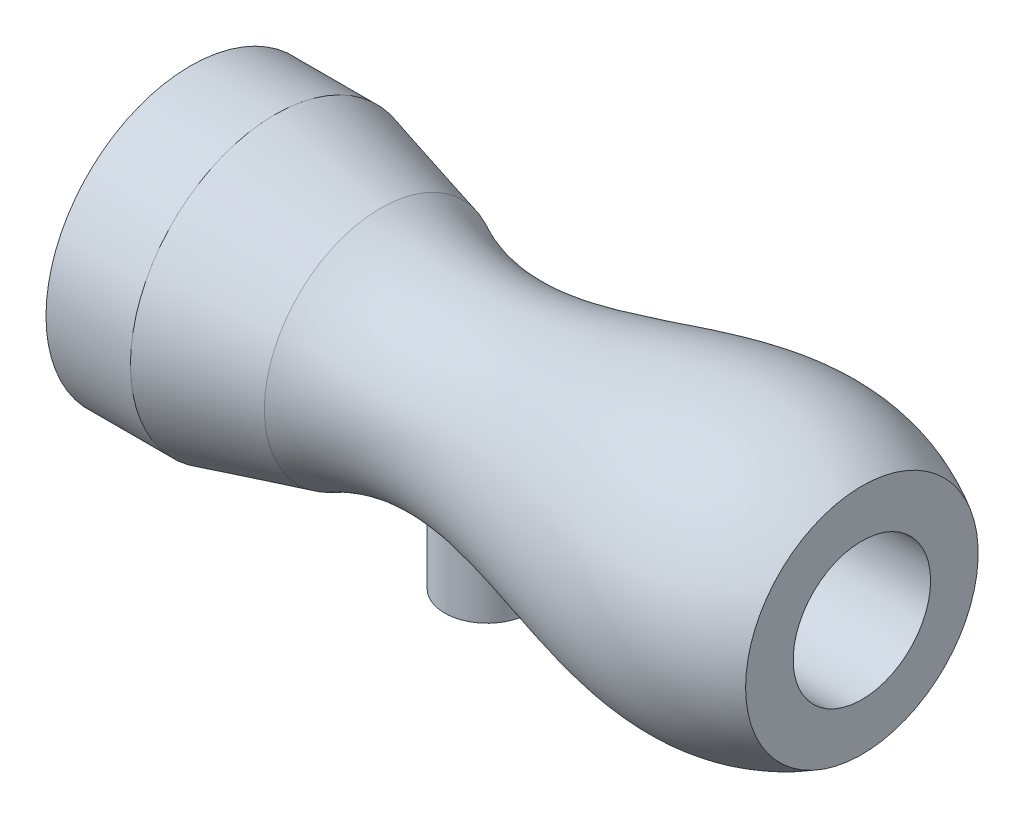
ISO-10303-21;
HEADER;
FILE_DESCRIPTION(('STEP AP214'),'2;1');
FILE_NAME('part.step','',(''),(''),'','','');
FILE_SCHEMA(('AUTOMOTIVE_DESIGN { 1 0 10303 214 1 1 1 1 }'));
ENDSEC;
DATA;
#1=APPLICATION_CONTEXT('core data for automotive mechanical design processes');
#2=APPLICATION_PROTOCOL_DEFINITION('international standard','automotive_design',2000,#1);
#3=PRODUCT_CONTEXT('',#1,'mechanical');
#4=PRODUCT('Part','Part','',(#3));
#5=PRODUCT_RELATED_PRODUCT_CATEGORY('part','',(#4));
#6=PRODUCT_DEFINITION_FORMATION('','',#4);
#7=PRODUCT_DEFINITION_CONTEXT('part definition',#1,'design');
#8=PRODUCT_DEFINITION('design','',#6,#7);
#9=PRODUCT_DEFINITION_SHAPE('','',#8);
#10=(LENGTH_UNIT() NAMED_UNIT(*) SI_UNIT(.MILLI.,.METRE.));
#11=(NAMED_UNIT(*) PLANE_ANGLE_UNIT() SI_UNIT($,.RADIAN.));
#12=(NAMED_UNIT(*) SI_UNIT($,.STERADIAN.) SOLID_ANGLE_UNIT());
#13=UNCERTAINTY_MEASURE_WITH_UNIT(LENGTH_MEASURE(1.E-05),#10,'distance_accuracy_value','');
#14=(GEOMETRIC_REPRESENTATION_CONTEXT(3) GLOBAL_UNCERTAINTY_ASSIGNED_CONTEXT((#13)) GLOBAL_UNIT_ASSIGNED_CONTEXT((#10,
#11,#12)) REPRESENTATION_CONTEXT('',''));
#15=CARTESIAN_POINT('',(0.,0.,0.));
#16=DIRECTION('',(0.,0.,1.));
#17=DIRECTION('',(1.,0.,0.));
#18=AXIS2_PLACEMENT_3D('',#15,#16,#17);
#19=CARTESIAN_POINT('',(308.823182562333,58.16448,0.));
#20=CARTESIAN_POINT('',(226.419832207654,105.291746385133,0.));
#21=CARTESIAN_POINT('',(147.660376362064,17.815554571353,0.));
#22=CARTESIAN_POINT('',(68.1078454194762,58.16448,0.));
#23=B_SPLINE_CURVE_WITH_KNOTS('',3,(#19,#20,#21,#22),.UNSPECIFIED.,.F.,.F.,(4,4),(0.,1.),.UNSPECIFIED.);
#24=CARTESIAN_POINT('',(0.,0.,0.));
#25=DIRECTION('',(-1.,0.,0.));
#26=AXIS1_PLACEMENT('',#24,#25);
#27=SURFACE_OF_REVOLUTION('',#23,#26);
#28=CARTESIAN_POINT('',(308.823182562333,0.,0.));
#29=DIRECTION('',(-1.,0.,0.));
#30=DIRECTION('',(0.,0.,1.));
#31=AXIS2_PLACEMENT_3D('',#28,#29,#30);
#32=CIRCLE('',#31,58.16448);
#33=CARTESIAN_POINT('',(308.823182562333,0.,58.16448));
#34=VERTEX_POINT('',#33);
#35=EDGE_CURVE('E63',#34,#34,#32,.T.);
#36=ORIENTED_EDGE('',*,*,#35,.T.);
#37=EDGE_LOOP('',(#36));
#38=FACE_BOUND('',#37,.T.);
#39=CARTESIAN_POINT('',(68.1078454194762,0.,0.));
#40=DIRECTION('',(-1.,0.,0.));
#41=DIRECTION('',(0.,0.,1.));
#42=AXIS2_PLACEMENT_3D('',#39,#40,#41);
#43=CIRCLE('',#42,58.16448);
#44=CARTESIAN_POINT('',(68.1078454194762,0.,58.16448));
#45=VERTEX_POINT('',#44);
#46=EDGE_CURVE('E58',#45,#45,#43,.T.);
#47=ORIENTED_EDGE('',*,*,#46,.F.);
#48=EDGE_LOOP('',(#47));
#49=FACE_BOUND('',#48,.T.);
#50=CARTESIAN_POINT('',(121.401340982903,-42.2995074956704,-21.25));
#51=CARTESIAN_POINT('',(121.956854107687,-42.3284219489446,-21.2499963005704));
#52=CARTESIAN_POINT('',(122.511654720183,-42.3720654452182,-21.2281824590766));
#53=CARTESIAN_POINT('',(123.614975151051,-42.4873996914502,-21.1416342784795));
#54=CARTESIAN_POINT('',(124.1634938838,-42.5590952162175,-21.0768926312187));
#55=CARTESIAN_POINT('',(125.250569384225,-42.7281910896153,-20.905718503867));
#56=CARTESIAN_POINT('',(125.789114058735,-42.8256207024853,-20.7992384926703));
#57=CARTESIAN_POINT('',(126.852015472128,-43.0429954515258,-20.5463168852489));
#58=CARTESIAN_POINT('',(127.37637237292,-43.1629403306307,-20.3998757452676));
#59=CARTESIAN_POINT('',(128.404412255171,-43.4208709930733,-20.0700991165551));
#60=CARTESIAN_POINT('',(128.908215046567,-43.5587234471341,-19.8870313655588));
#61=CARTESIAN_POINT('',(129.896895278524,-43.8494882997174,-19.4851959859333));
#62=CARTESIAN_POINT('',(130.381770604776,-44.0024023740275,-19.2664243830358));
#63=CARTESIAN_POINT('',(131.330793297158,-44.319635213887,-18.7949256345552));
#64=CARTESIAN_POINT('',(131.794940789692,-44.4839539098725,-18.5421986960787));
#65=CARTESIAN_POINT('',(132.701074348457,-44.8204547936896,-18.0043373351002));
#66=CARTESIAN_POINT('',(133.143059005168,-44.9926374803306,-17.7192008551634));
#67=CARTESIAN_POINT('',(134.054305800566,-45.3620219852101,-17.0824266803393));
#68=CARTESIAN_POINT('',(134.52063833161,-45.559779773458,-16.7269120240432));
#69=CARTESIAN_POINT('',(135.422146265741,-45.9562603348266,-15.9788188063986));
#70=CARTESIAN_POINT('',(135.857319713543,-46.1549831676714,-15.5862379226599));
#71=CARTESIAN_POINT('',(136.69484401878,-46.5491018911935,-14.7653408621851));
#72=CARTESIAN_POINT('',(137.097172946481,-46.7444954912208,-14.3370011896949));
#73=CARTESIAN_POINT('',(137.866522660857,-47.1275188384948,-13.4464327512267));
#74=CARTESIAN_POINT('',(138.233542484851,-47.3151483739793,-12.9842030618618));
#75=CARTESIAN_POINT('',(138.953994979577,-47.6910429704584,-11.994455559052));
#76=CARTESIAN_POINT('',(139.3047208435,-47.8784499578015,-11.4646330833479));
#77=CARTESIAN_POINT('',(139.959697339702,-48.2345610674749,-10.3709294696912));
#78=CARTESIAN_POINT('',(140.263944719392,-48.4032638806508,-9.80704595197878));
#79=CARTESIAN_POINT('',(140.822117735954,-48.7169869381002,-8.64919360878423));
#80=CARTESIAN_POINT('',(141.076088613436,-48.8620284527937,-8.05525244022972));
#81=CARTESIAN_POINT('',(141.530411865118,-49.1241207383771,-6.84125828807866));
#82=CARTESIAN_POINT('',(141.730773831936,-49.2411765165511,-6.22120999902393));
#83=CARTESIAN_POINT('',(142.055653202545,-49.4322984859265,-5.0299141104889));
#84=CARTESIAN_POINT('',(142.18609195569,-49.5096786909101,-4.46080882642319));
#85=CARTESIAN_POINT('',(142.399983914868,-49.6370629133613,-3.31080579454934));
#86=CARTESIAN_POINT('',(142.483440544123,-49.6870689253658,-2.72990890909952));
#87=CARTESIAN_POINT('',(142.601991026598,-49.7582175124629,-1.56183735306943));
#88=CARTESIAN_POINT('',(142.637117563901,-49.7793795936846,-0.974667195970781));
#89=CARTESIAN_POINT('',(142.658519489121,-49.7922645743623,0.200866207411033));
#90=CARTESIAN_POINT('',(142.644798918204,-49.7839899091472,0.7892293509725));
#91=CARTESIAN_POINT('',(142.573194531023,-49.7409342704921,1.89330597027824));
#92=CARTESIAN_POINT('',(142.520639234057,-49.7093519560574,2.40950141665854));
#93=CARTESIAN_POINT('',(142.378285743386,-49.6241612496439,3.4348398049399));
#94=CARTESIAN_POINT('',(142.288491195897,-49.5705550141036,3.94398343226513));
#95=CARTESIAN_POINT('',(142.072746350882,-49.4425163649281,4.95188403686953));
#96=CARTESIAN_POINT('',(141.946793982883,-49.3680827586797,5.45064041759828));
#97=CARTESIAN_POINT('',(141.660148783426,-49.1999901831949,6.43474138222507));
#98=CARTESIAN_POINT('',(141.499454316334,-49.1063303088089,6.92008533346095));
#99=CARTESIAN_POINT('',(141.141503710037,-48.8997026708808,7.88403096795797));
#100=CARTESIAN_POINT('',(140.943596663309,-48.7863945039597,8.36231742174183));
#101=CARTESIAN_POINT('',(140.515212474964,-48.5440453725047,9.29989738915615));
#102=CARTESIAN_POINT('',(140.284735334503,-48.4150044085299,9.75919090346157));
#103=CARTESIAN_POINT('',(139.793008912608,-48.1435849891127,10.6569725936064));
#104=CARTESIAN_POINT('',(139.531753920244,-48.0012040594025,11.0954568869851));
#105=CARTESIAN_POINT('',(138.980264657968,-47.7056404569746,11.9500042434064));
#106=CARTESIAN_POINT('',(138.690027413739,-47.5524566760841,12.3660649984624));
#107=CARTESIAN_POINT('',(138.044201426401,-47.218197017145,13.2250296865341));
#108=CARTESIAN_POINT('',(137.684979397876,-47.0360291242511,13.6647806511368));
#109=CARTESIAN_POINT('',(136.934088417104,-46.6650701840181,14.5126498829839));
#110=CARTESIAN_POINT('',(136.542417120734,-46.4762786587593,14.9207658607989));
#111=CARTESIAN_POINT('',(135.728080968747,-46.0957191482858,15.7043514986222));
#112=CARTESIAN_POINT('',(135.30538203547,-45.9039480784536,16.0797842430556));
#113=CARTESIAN_POINT('',(134.43109446041,-45.5216148656841,16.7960535746231));
#114=CARTESIAN_POINT('',(133.979504616274,-45.331052773424,17.1368887203779));
#115=CARTESIAN_POINT('',(132.998544786943,-44.9348673518278,17.817444026285));
#116=CARTESIAN_POINT('',(132.466051349288,-44.7298525258712,18.1530328044281));
#117=CARTESIAN_POINT('',(131.369740926168,-44.332233610734,18.7774190030095));
#118=CARTESIAN_POINT('',(130.805919446167,-44.1396313109451,19.0662096860746));
#119=CARTESIAN_POINT('',(129.650385470119,-43.773236766001,19.59384201369));
#120=CARTESIAN_POINT('',(129.058709580769,-43.5994207705063,19.832747090381));
#121=CARTESIAN_POINT('',(127.850262451836,-43.2766042189408,20.2579323844686));
#122=CARTESIAN_POINT('',(127.233499689255,-43.1275953656604,20.4442302119099));
#123=CARTESIAN_POINT('',(126.120922827097,-42.8905515347731,20.7253216910306));
#124=CARTESIAN_POINT('',(125.629218823411,-42.7963449390086,20.8312772616923));
#125=CARTESIAN_POINT('',(124.636073688394,-42.6289127916961,21.0084101639262));
#126=CARTESIAN_POINT('',(124.134634014725,-42.5556841247293,21.0795926607342));
#127=CARTESIAN_POINT('',(123.12556102502,-42.4323329838716,21.1860030099809));
#128=CARTESIAN_POINT('',(122.617933460675,-42.3821905160932,21.2212620063246));
#129=CARTESIAN_POINT('',(121.599604353685,-42.3063450699756,21.2551806757914));
#130=CARTESIAN_POINT('',(121.088902746392,-42.2806426074463,21.2538395764818));
#131=CARTESIAN_POINT('',(120.06741964398,-42.254285018815,21.2142602264346));
#132=CARTESIAN_POINT('',(119.556639452373,-42.2536719882006,21.1759600753195));
#133=CARTESIAN_POINT('',(118.539759926105,-42.2773385230921,21.0626585598619));
#134=CARTESIAN_POINT('',(118.03366060077,-42.3016181381845,20.9876571224102));
#135=CARTESIAN_POINT('',(117.029604202778,-42.3739577859516,20.8017126033523));
#136=CARTESIAN_POINT('',(116.531651253949,-42.4220294998791,20.6907518759917));
#137=CARTESIAN_POINT('',(115.547454425699,-42.5400798787266,20.4341178701414));
#138=CARTESIAN_POINT('',(115.061210751898,-42.6100589280486,20.2884439825601));
#139=CARTESIAN_POINT('',(114.109105226223,-42.7685047209665,19.9658555967025));
#140=CARTESIAN_POINT('',(113.643067207544,-42.8567357807234,19.7893434306091));
#141=CARTESIAN_POINT('',(112.727408310138,-43.049474648404,19.4054596846691));
#142=CARTESIAN_POINT('',(112.277787156927,-43.1539821840373,19.198088621066));
#143=CARTESIAN_POINT('',(111.396712265808,-43.3763888127285,18.7540211042387));
#144=CARTESIAN_POINT('',(110.965259511824,-43.4942886297806,18.5173230655189));
#145=CARTESIAN_POINT('',(110.121808756301,-43.7405729281364,18.0159784799079));
#146=CARTESIAN_POINT('',(109.70981947284,-43.8689620388318,17.7513195773734));
#147=CARTESIAN_POINT('',(108.848329432043,-44.1524527409451,17.1550930926544));
#148=CARTESIAN_POINT('',(108.402070996602,-44.3087257653751,16.8193905482483));
#149=CARTESIAN_POINT('',(107.538632745681,-44.626763748357,16.1151525019001));
#150=CARTESIAN_POINT('',(107.121444676512,-44.7885271285245,15.746626387516));
#151=CARTESIAN_POINT('',(106.317112281678,-45.1135979527701,14.97792670592));
#152=CARTESIAN_POINT('',(105.929997844282,-45.2769067564516,14.5777224333113));
#153=CARTESIAN_POINT('',(105.187860114058,-45.6008821654632,13.7475653431324));
#154=CARTESIAN_POINT('',(104.832838376001,-45.7615486424743,13.3176110860661));
#155=CARTESIAN_POINT('',(104.118390268749,-46.0941329879907,12.3793357530714));
#156=CARTESIAN_POINT('',(103.763002221199,-46.2652697972552,11.8676500004172));
#157=CARTESIAN_POINT('',(103.096818096142,-46.5942141332896,10.8118715227044));
#158=CARTESIAN_POINT('',(102.786025957022,-46.7520204823049,10.2677759414434));
#159=CARTESIAN_POINT('',(102.212157965221,-47.0492119637137,9.15051254800047));
#160=CARTESIAN_POINT('',(101.949055525702,-47.1886073483196,8.5773611638265));
#161=CARTESIAN_POINT('',(101.473447622039,-47.4443989247661,7.40548952975689));
#162=CARTESIAN_POINT('',(101.260935745688,-47.5607980309992,6.80677253158501));
#163=CARTESIAN_POINT('',(100.902316829757,-47.7593403179632,5.63061957103433));
#164=CARTESIAN_POINT('',(100.752629787898,-47.8432978074783,5.05458205114607));
#165=CARTESIAN_POINT('',(100.501706212305,-47.98496814695,3.88884836063277));
#166=CARTESIAN_POINT('',(100.400467731855,-48.0426820513985,3.29915273980385));
#167=CARTESIAN_POINT('',(100.248061271873,-48.1298496056195,2.11170562603893));
#168=CARTESIAN_POINT('',(100.196854793311,-48.1593249842608,1.51396068661137));
#169=CARTESIAN_POINT('',(100.145224484641,-48.1890441281214,0.315580076484639));
#170=CARTESIAN_POINT('',(100.144795575317,-48.1892908170496,-0.285055299077182));
#171=CARTESIAN_POINT('',(100.191721015275,-48.1622803178617,-1.41196394593656));
#172=CARTESIAN_POINT('',(100.233384209541,-48.1382989414275,-1.93856482427724));
#173=CARTESIAN_POINT('',(100.355538970228,-48.0683452359098,-2.98571879509912));
#174=CARTESIAN_POINT('',(100.436026792665,-48.022375027284,-3.50627246577623));
#175=CARTESIAN_POINT('',(100.634862343329,-47.9096696414786,-4.53782271128267));
#176=CARTESIAN_POINT('',(100.753213002657,-47.8429328566924,-5.04881854296165));
#177=CARTESIAN_POINT('',(101.026452003185,-47.6904156049786,-6.05802977261598));
#178=CARTESIAN_POINT('',(101.181341917343,-47.6046343182242,-6.55624461936592));
#179=CARTESIAN_POINT('',(101.527634710316,-47.4153024264399,-7.5414436301145));
#180=CARTESIAN_POINT('',(101.719349493795,-47.3116008502557,-8.0282888486213));
#181=CARTESIAN_POINT('',(102.136671409781,-47.0894294203982,-8.98369493057024));
#182=CARTESIAN_POINT('',(102.362278301049,-46.9709596718429,-9.45225592412592));
#183=CARTESIAN_POINT('',(102.845725803438,-46.7218943777563,-10.3692020577044));
#184=CARTESIAN_POINT('',(103.10357396466,-46.5912959938497,-10.8175824383734));
#185=CARTESIAN_POINT('',(103.64982923968,-46.3208081422436,-11.6924042517054));
#186=CARTESIAN_POINT('',(103.938239253144,-46.1809177934062,-12.1188435969214));
#187=CARTESIAN_POINT('',(104.580528112766,-45.8775578549182,-12.9982225684518));
#188=CARTESIAN_POINT('',(104.938109139278,-45.7132757363177,-13.4481821242722));
#189=CARTESIAN_POINT('',(105.687744265343,-45.3809593212385,-14.3169345466888));
#190=CARTESIAN_POINT('',(106.079800842823,-45.2129247557016,-14.7357251690193));
#191=CARTESIAN_POINT('',(106.897064550615,-44.8772992305915,-15.5408444212371));
#192=CARTESIAN_POINT('',(107.322308079321,-44.7097089725912,-15.9271364150767));
#193=CARTESIAN_POINT('',(108.20387907125,-44.3797065047606,-16.6649305736283));
#194=CARTESIAN_POINT('',(108.660207458776,-44.2172944491142,-17.0164317030773));
#195=CARTESIAN_POINT('',(109.641036620629,-43.8893865048871,-17.7100967923833));
#196=CARTESIAN_POINT('',(110.168057256423,-43.7247364764206,-18.049112633113));
#197=CARTESIAN_POINT('',(111.254031725698,-43.413149949006,-18.6812595905322));
#198=CARTESIAN_POINT('',(111.812989679477,-43.2662157432515,-18.9743847684478));
#199=CARTESIAN_POINT('',(112.958639327041,-42.9965159115824,-19.511081735521));
#200=CARTESIAN_POINT('',(113.545274449268,-42.8737034275758,-19.7547496302211));
#201=CARTESIAN_POINT('',(114.443183013869,-42.7117950653069,-20.0810374487567));
#202=CARTESIAN_POINT('',(114.745471969419,-42.6615448273963,-20.1832626467835));
#203=CARTESIAN_POINT('',(115.35546311047,-42.5691120028502,-20.3742967725411));
#204=CARTESIAN_POINT('',(115.663164805312,-42.5269286890308,-20.4631069094058));
#205=CARTESIAN_POINT('',(116.413315190172,-42.4353611473258,-20.6612973664496));
#206=CARTESIAN_POINT('',(116.858176003593,-42.3903715278324,-20.7636934285138));
#207=CARTESIAN_POINT('',(117.754924852504,-42.3192690728949,-20.9397927716464));
#208=CARTESIAN_POINT('',(118.206811400806,-42.2931522966108,-21.013502041322));
#209=CARTESIAN_POINT('',(119.114986229145,-42.2607093528696,-21.1316033321549));
#210=CARTESIAN_POINT('',(119.571273124707,-42.2543771520898,-21.1760042876484));
#211=CARTESIAN_POINT('',(120.485647989568,-42.2618654838156,-21.2352064633952));
#212=CARTESIAN_POINT('',(120.943736229715,-42.2756891722793,-21.2500030474106));
#213=CARTESIAN_POINT('',(121.401340982903,-42.2995074956704,-21.25));
#214=B_SPLINE_CURVE_WITH_KNOTS('',3,(#50,#51,#52,#53,#54,#55,#56,#57,#58,#59,#60,#61,#62,#63,
#64,#65,#66,#67,#68,#69,#70,#71,#72,#73,#74,#75,#76,#77,#78,#79,#80,#81,#82,#83,#84,#85,#86,#87,
#88,#89,#90,#91,#92,#93,#94,#95,#96,#97,#98,#99,#100,#101,#102,#103,#104,#105,#106,#107,#108,
#109,#110,#111,#112,#113,#114,#115,#116,#117,#118,#119,#120,#121,#122,#123,#124,#125,#126,#127,
#128,#129,#130,#131,#132,#133,#134,#135,#136,#137,#138,#139,#140,#141,#142,#143,#144,#145,#146,
#147,#148,#149,#150,#151,#152,#153,#154,#155,#156,#157,#158,#159,#160,#161,#162,#163,#164,#165,
#166,#167,#168,#169,#170,#171,#172,#173,#174,#175,#176,#177,#178,#179,#180,#181,#182,#183,#184,
#185,#186,#187,#188,#189,#190,#191,#192,#193,#194,#195,#196,#197,#198,#199,#200,#201,#202,#203,
#204,#205,#206,#207,#208,#209,#210,#211,#212,#213),.UNSPECIFIED.,.T.,.F.,(4,2,2,2,2,2,2,2,2,2,2,
2,2,2,2,2,2,2,2,2,2,2,2,2,2,2,2,2,2,2,2,2,2,2,2,2,2,2,2,2,2,2,2,2,2,2,2,2,2,2,2,2,2,2,2,2,2,2,2,
2,2,2,2,2,2,2,2,2,2,2,2,2,2,2,2,2,2,2,2,2,2,4),(0.,1.66829105381153,3.33686619540842,
5.00734703491327,6.67780880303685,8.33647863401065,9.99533322098161,11.6541776904227,
13.313127526134,15.1677075336495,17.0224038173669,18.8783284912818,20.7343037515953,
22.7189731775528,24.7037814281551,26.6867954762464,28.6694544520957,30.4338443760352,
32.1981057259816,33.9611733754909,35.7240951682049,37.2817377405993,38.839227835154,
40.3968071326918,41.9544597760221,43.5424382699124,45.1304167073703,46.7186902648948,
48.3071269875857,50.0942708730447,51.8815439738846,53.6708102863781,55.4601511113713,
57.4435879699003,59.4273101243393,61.4084943025562,63.3890144998062,64.922656952276,
66.456071526258,67.9881555712339,69.5202719503515,71.0549588359267,72.5896487786241,
74.1250929595869,75.6605640840782,77.1773238809497,78.6940583065515,80.2108747667288,
81.7283643197855,83.4662488007667,85.2036378321849,86.9427320232172,88.6819104217666,
90.6176795536068,92.5536195333832,94.4884768914886,96.4230888813636,98.2236985698666,
100.024235901782,101.823386647934,103.622357427144,105.206834868645,106.791159544396,
108.375606898265,109.960122472567,111.558703067756,113.157272285109,114.756216551118,
116.35531265878,118.146708266681,119.938232736419,121.731750478973,123.525321574752,
125.466472899077,127.407875223184,129.345468108316,130.314223804213,131.282892131504,
132.657640500826,134.032101725816,135.406143766792,136.780400974888),.UNSPECIFIED.);
#215=CARTESIAN_POINT('',(121.401340982903,-42.2995074956704,-21.25));
#216=VERTEX_POINT('',#215);
#217=EDGE_CURVE('E11',#216,#216,#214,.T.);
#218=ORIENTED_EDGE('',*,*,#217,.F.);
#219=EDGE_LOOP('',(#218));
#220=FACE_BOUND('',#219,.T.);
#221=ADVANCED_FACE('F43',(#38,#49,#220),#27,.T.);
#222=CARTESIAN_POINT('',(0.,0.,0.));
#223=DIRECTION('',(-1.,0.,0.));
#224=DIRECTION('',(0.,0.,1.));
#225=AXIS2_PLACEMENT_3D('',#222,#223,#224);
#226=CYLINDRICAL_SURFACE('',#225,72.26496);
#227=CARTESIAN_POINT('',(15.2310454194763,0.,0.));
#228=DIRECTION('',(-1.,0.,0.));
#229=DIRECTION('',(0.,0.,1.));
#230=AXIS2_PLACEMENT_3D('',#227,#228,#229);
#231=CIRCLE('',#230,72.26496);
#232=CARTESIAN_POINT('',(15.2310454194763,0.,72.26496));
#233=VERTEX_POINT('',#232);
#234=EDGE_CURVE('E54',#233,#233,#231,.T.);
#235=ORIENTED_EDGE('',*,*,#234,.T.);
#236=EDGE_LOOP('',(#235));
#237=FACE_BOUND('',#236,.T.);
#238=CARTESIAN_POINT('',(-27.,0.,0.));
#239=DIRECTION('',(-1.,0.,0.));
#240=DIRECTION('',(0.,0.,1.));
#241=AXIS2_PLACEMENT_3D('',#238,#239,#240);
#242=CIRCLE('',#241,72.26496);
#243=CARTESIAN_POINT('',(-27.,0.,72.26496));
#244=VERTEX_POINT('',#243);
#245=EDGE_CURVE('E138',#244,#244,#242,.T.);
#246=ORIENTED_EDGE('',*,*,#245,.F.);
#247=EDGE_LOOP('',(#246));
#248=FACE_BOUND('',#247,.T.);
#249=ADVANCED_FACE('F45',(#237,#248),#226,.T.);
#250=CARTESIAN_POINT('',(68.1078454194762,0.,0.));
#251=DIRECTION('',(-1.,0.,0.));
#252=DIRECTION('',(0.,0.,1.));
#253=AXIS2_PLACEMENT_3D('',#250,#251,#252);
#254=CONICAL_SURFACE('',#253,58.16448,0.260602391747341);
#255=ORIENTED_EDGE('',*,*,#234,.F.);
#256=EDGE_LOOP('',(#255));
#257=FACE_BOUND('',#256,.T.);
#258=ORIENTED_EDGE('',*,*,#46,.T.);
#259=EDGE_LOOP('',(#258));
#260=FACE_BOUND('',#259,.T.);
#261=ADVANCED_FACE('F98',(#257,#260),#254,.T.);
#262=CARTESIAN_POINT('',(308.823182562333,0.,0.));
#263=DIRECTION('',(-1.,0.,0.));
#264=DIRECTION('',(0.,0.,1.));
#265=AXIS2_PLACEMENT_3D('',#262,#263,#264);
#266=PLANE('',#265);
#267=CARTESIAN_POINT('',(308.823182562333,0.,0.));
#268=DIRECTION('',(1.,0.,0.));
#269=DIRECTION('',(0.,0.,-1.));
#270=AXIS2_PLACEMENT_3D('',#267,#268,#269);
#271=CIRCLE('',#270,34.3708416246906);
#272=CARTESIAN_POINT('',(308.823182562333,0.,-34.3708416246906));
#273=VERTEX_POINT('',#272);
#274=EDGE_CURVE('E71',#273,#273,#271,.T.);
#275=ORIENTED_EDGE('',*,*,#274,.F.);
#276=EDGE_LOOP('',(#275));
#277=FACE_BOUND('',#276,.T.);
#278=ORIENTED_EDGE('',*,*,#35,.F.);
#279=EDGE_LOOP('',(#278));
#280=FACE_BOUND('',#279,.T.);
#281=ADVANCED_FACE('F95',(#277,#280),#266,.F.);
#282=CARTESIAN_POINT('',(78.8231825623333,0.,0.));
#283=DIRECTION('',(1.,0.,0.));
#284=DIRECTION('',(0.,0.,-1.));
#285=AXIS2_PLACEMENT_3D('',#282,#283,#284);
#286=CYLINDRICAL_SURFACE('',#285,34.3708416246906);
#287=CARTESIAN_POINT('',(78.8231825623333,0.,0.));
#288=DIRECTION('',(1.,0.,0.));
#289=DIRECTION('',(0.,0.,-1.));
#290=AXIS2_PLACEMENT_3D('',#287,#288,#289);
#291=CIRCLE('',#290,34.3708416246906);
#292=CARTESIAN_POINT('',(78.8231825623333,0.,-34.3708416246906));
#293=VERTEX_POINT('',#292);
#294=EDGE_CURVE('E142',#293,#293,#291,.T.);
#295=ORIENTED_EDGE('',*,*,#294,.F.);
#296=EDGE_LOOP('',(#295));
#297=FACE_BOUND('',#296,.T.);
#298=ORIENTED_EDGE('',*,*,#274,.T.);
#299=EDGE_LOOP('',(#298));
#300=FACE_BOUND('',#299,.T.);
#301=ADVANCED_FACE('F92',(#297,#300),#286,.F.);
#302=CARTESIAN_POINT('',(78.8231825623333,0.,0.));
#303=DIRECTION('',(1.,0.,0.));
#304=DIRECTION('',(0.,0.,-1.));
#305=AXIS2_PLACEMENT_3D('',#302,#303,#304);
#306=PLANE('',#305);
#307=ORIENTED_EDGE('',*,*,#294,.T.);
#308=EDGE_LOOP('',(#307));
#309=FACE_BOUND('',#308,.T.);
#310=ADVANCED_FACE('F88',(#309),#306,.T.);
#311=CARTESIAN_POINT('',(121.401340982903,-37.,0.));
#312=DIRECTION('',(0.,-1.,0.));
#313=DIRECTION('',(0.,0.,-1.));
#314=AXIS2_PLACEMENT_3D('',#311,#312,#313);
#315=CYLINDRICAL_SURFACE('',#314,21.25);
#316=CARTESIAN_POINT('',(121.401340982903,-80.,0.));
#317=DIRECTION('',(0.,1.,0.));
#318=DIRECTION('',(1.,0.,0.));
#319=AXIS2_PLACEMENT_3D('',#316,#317,#318);
#320=CIRCLE('',#319,21.25);
#321=CARTESIAN_POINT('',(142.651340982903,-80.,0.));
#322=VERTEX_POINT('',#321);
#323=EDGE_CURVE('E72',#322,#322,#320,.T.);
#324=ORIENTED_EDGE('',*,*,#323,.T.);
#325=EDGE_LOOP('',(#324));
#326=FACE_BOUND('',#325,.T.);
#327=ORIENTED_EDGE('',*,*,#217,.T.);
#328=EDGE_LOOP('',(#327));
#329=FACE_BOUND('',#328,.T.);
#330=ADVANCED_FACE('F82',(#326,#329),#315,.T.);
#331=CARTESIAN_POINT('',(121.401340982903,-37.,0.));
#332=DIRECTION('',(0.,-1.,0.));
#333=DIRECTION('',(0.,0.,-1.));
#334=AXIS2_PLACEMENT_3D('',#331,#332,#333);
#335=CYLINDRICAL_SURFACE('',#334,11.25);
#336=CARTESIAN_POINT('',(121.401340982903,-80.,0.));
#337=DIRECTION('',(0.,1.,0.));
#338=DIRECTION('',(0.,0.,1.));
#339=AXIS2_PLACEMENT_3D('',#336,#337,#338);
#340=CIRCLE('',#339,11.25);
#341=CARTESIAN_POINT('',(121.401340982903,-80.,11.25));
#342=VERTEX_POINT('',#341);
#343=EDGE_CURVE('E134',#342,#342,#340,.T.);
#344=ORIENTED_EDGE('',*,*,#343,.F.);
#345=EDGE_LOOP('',(#344));
#346=FACE_BOUND('',#345,.T.);
#347=CARTESIAN_POINT('',(121.401340982903,-45.9809562142446,-11.25));
#348=CARTESIAN_POINT('',(121.712283968242,-45.9958430648076,-11.2499992878845));
#349=CARTESIAN_POINT('',(122.023035685195,-46.0149759755759,-11.2370973731547));
#350=CARTESIAN_POINT('',(122.641807613552,-46.0614057143334,-11.1857114422465));
#351=CARTESIAN_POINT('',(122.949827652247,-46.0887030547775,-11.1472258200757));
#352=CARTESIAN_POINT('',(123.561002920251,-46.1508948805872,-11.0451069533058));
#353=CARTESIAN_POINT('',(123.86415630971,-46.1857921697395,-10.9814644206927));
#354=CARTESIAN_POINT('',(124.463374554904,-46.2623857400393,-10.8296805434141));
#355=CARTESIAN_POINT('',(124.759439471744,-46.3040819625546,-10.7415394100132));
#356=CARTESIAN_POINT('',(125.3418989822,-46.3932096917794,-10.5417783272247));
#357=CARTESIAN_POINT('',(125.628313340796,-46.4406284333405,-10.4302102389252));
#358=CARTESIAN_POINT('',(126.190374211461,-46.5401817452584,-10.1843875807054));
#359=CARTESIAN_POINT('',(126.46602072666,-46.5923163142443,-10.0501330173802));
#360=CARTESIAN_POINT('',(127.004895834119,-46.7001118600744,-9.75993438853156));
#361=CARTESIAN_POINT('',(127.268125264175,-46.7557725984081,-9.60399178913842));
#362=CARTESIAN_POINT('',(127.780764855523,-46.8693958715905,-9.27139922315475));
#363=CARTESIAN_POINT('',(128.030170035314,-46.9273592234238,-9.09474186262844));
#364=CARTESIAN_POINT('',(128.52237454477,-47.0463971899648,-8.715126164348));
#365=CARTESIAN_POINT('',(128.764610824697,-47.1075086024038,-8.51144883005421));
#366=CARTESIAN_POINT('',(129.231123246504,-47.2293624949871,-8.08436894801429));
#367=CARTESIAN_POINT('',(129.455399208445,-47.2901049714294,-7.86096620269251));
#368=CARTESIAN_POINT('',(129.884622035827,-47.4098060708385,-7.39571789303714));
#369=CARTESIAN_POINT('',(130.089562650787,-47.4687641128012,-7.15386641021695));
#370=CARTESIAN_POINT('',(130.478564000822,-47.5834485557067,-6.65334095153531));
#371=CARTESIAN_POINT('',(130.662632414095,-47.6391761413168,-6.39467321727542));
#372=CARTESIAN_POINT('',(131.011122467703,-47.7468433282002,-5.85818880408575));
#373=CARTESIAN_POINT('',(131.175222982259,-47.7987168173539,-5.58014999714464));
#374=CARTESIAN_POINT('',(131.479298021421,-47.8964489114872,-5.01015154786622));
#375=CARTESIAN_POINT('',(131.619272160241,-47.9423074202835,-4.71819168302413));
#376=CARTESIAN_POINT('',(131.873809459437,-48.0267931665985,-4.12247357323606));
#377=CARTESIAN_POINT('',(131.988379556347,-48.0654223776154,-3.81871857561876));
#378=CARTESIAN_POINT('',(132.191048066207,-48.1344195292168,-3.20159089962808));
#379=CARTESIAN_POINT('',(132.27914781044,-48.1647878852605,-2.88821870581015));
#380=CARTESIAN_POINT('',(132.424672196041,-48.2152779565958,-2.26836545519515));
#381=CARTESIAN_POINT('',(132.483283644634,-48.2357942631539,-1.9621948369539));
#382=CARTESIAN_POINT('',(132.574927237119,-48.2679846051523,-1.34558881256895));
#383=CARTESIAN_POINT('',(132.607960112829,-48.2796588935678,-1.03515352869843));
#384=CARTESIAN_POINT('',(132.648104068254,-48.2938568439844,-0.412474565378072));
#385=CARTESIAN_POINT('',(132.655221118042,-48.2963826134737,-0.10023131901988));
#386=CARTESIAN_POINT('',(132.643475459566,-48.2922222821762,0.523701017934486));
#387=CARTESIAN_POINT('',(132.624613321498,-48.2855363835688,0.835390120542778));
#388=CARTESIAN_POINT('',(132.562409648975,-48.2635902045219,1.44308301626766));
#389=CARTESIAN_POINT('',(132.520102106761,-48.2486922324301,1.73920647666835));
#390=CARTESIAN_POINT('',(132.412171850771,-48.2109473978939,2.32664623586198));
#391=CARTESIAN_POINT('',(132.346549905836,-48.1881007975724,2.6179626928442));
#392=CARTESIAN_POINT('',(132.192575218242,-48.1349974101204,3.19383899232801));
#393=CARTESIAN_POINT('',(132.104221515102,-48.1047403098783,3.47839854877653));
#394=CARTESIAN_POINT('',(131.905533381371,-48.037515559014,4.03891863980095));
#395=CARTESIAN_POINT('',(131.795198411059,-48.0005477436207,4.31487896304106));
#396=CARTESIAN_POINT('',(131.551478608542,-47.920092034314,4.86086569625454));
#397=CARTESIAN_POINT('',(131.417751412442,-47.8765087875484,5.13072514414968));
#398=CARTESIAN_POINT('',(131.129528927254,-47.7842613104493,5.65819672292801));
#399=CARTESIAN_POINT('',(130.975033532967,-47.7355970543788,5.91580879176474));
#400=CARTESIAN_POINT('',(130.646351949107,-47.6342585165664,6.41733346669228));
#401=CARTESIAN_POINT('',(130.472164510166,-47.5815839804605,6.66124520209065));
#402=CARTESIAN_POINT('',(130.105180768986,-47.4733470469786,7.13409256518457));
#403=CARTESIAN_POINT('',(129.912377828876,-47.4177836227734,7.36302280163007));
#404=CARTESIAN_POINT('',(129.49889267258,-47.3020298554224,7.8160755957384));
#405=CARTESIAN_POINT('',(129.277281857552,-47.2417491877804,8.03932833772341));
#406=CARTESIAN_POINT('',(128.816222928655,-47.1207231300819,8.46645057378022));
#407=CARTESIAN_POINT('',(128.5767743963,-47.0599777291524,8.67031961283955));
#408=CARTESIAN_POINT('',(128.081407396676,-46.9394144673111,9.05748692241768));
#409=CARTESIAN_POINT('',(127.825482544207,-46.8795969772802,9.24077714143542));
#410=CARTESIAN_POINT('',(127.298886457054,-46.7623397906458,9.58542875918821));
#411=CARTESIAN_POINT('',(127.028220523912,-46.7048992520951,9.74679796967433));
#412=CARTESIAN_POINT('',(126.467312790358,-46.5924571229877,10.0499942536255));
#413=CARTESIAN_POINT('',(126.176763766579,-46.5375421290057,10.1912858848689));
#414=CARTESIAN_POINT('',(125.583770407216,-46.4329913665084,10.4486483160859));
#415=CARTESIAN_POINT('',(125.281325817509,-46.3833557108588,10.5647185769128));
#416=CARTESIAN_POINT('',(124.666716910379,-46.2906459332677,10.7705531483266));
#417=CARTESIAN_POINT('',(124.354555202261,-46.2475700678456,10.8603244546079));
#418=CARTESIAN_POINT('',(123.722726027532,-46.1690673289897,11.012686371652));
#419=CARTESIAN_POINT('',(123.403058914494,-46.1336400960338,11.0752782601167));
#420=CARTESIAN_POINT('',(122.770984700082,-46.0725033105349,11.1707118231696));
#421=CARTESIAN_POINT('',(122.458765915374,-46.0464745755805,11.2045974223845));
#422=CARTESIAN_POINT('',(121.831999942633,-46.0028550191997,11.2461399002569));
#423=CARTESIAN_POINT('',(121.517452810147,-45.9852639971354,11.2537974026116));
#424=CARTESIAN_POINT('',(120.888527112311,-45.9588084222228,11.2427051587406));
#425=CARTESIAN_POINT('',(120.574148524959,-45.9499419069958,11.2239613531941));
#426=CARTESIAN_POINT('',(119.947950762257,-45.9409311892421,11.1601612037971));
#427=CARTESIAN_POINT('',(119.63613152726,-45.9407867828617,11.1151054749357));
#428=CARTESIAN_POINT('',(119.03036454919,-45.948765688981,11.0014525027787));
#429=CARTESIAN_POINT('',(118.736213069603,-45.9565452164922,10.9339128813775));
#430=CARTESIAN_POINT('',(118.154557658442,-45.9793706692572,10.7755160728125));
#431=CARTESIAN_POINT('',(117.86705351301,-45.9944163604021,10.6846596369384));
#432=CARTESIAN_POINT('',(117.300616823704,-46.0310913524446,10.4803255372777));
#433=CARTESIAN_POINT('',(117.021684907781,-46.0527211343931,10.3668462208132));
#434=CARTESIAN_POINT('',(116.474223445985,-46.101709725362,10.1181230233541));
#435=CARTESIAN_POINT('',(116.205694151655,-46.1290686728148,9.98287861647344));
#436=CARTESIAN_POINT('',(115.676817122746,-46.1889693550286,9.68943421039559));
#437=CARTESIAN_POINT('',(115.41665001445,-46.2215819974825,9.53092324664668));
#438=CARTESIAN_POINT('',(114.91027661321,-46.2905675637679,9.1935401303593));
#439=CARTESIAN_POINT('',(114.664075151079,-46.3269417766175,9.01466099590226));
#440=CARTESIAN_POINT('',(114.18719359585,-46.4022408663491,8.63776289421089));
#441=CARTESIAN_POINT('',(113.95651402035,-46.4411658282039,8.43974328924713));
#442=CARTESIAN_POINT('',(113.512043852171,-46.5203306178088,8.02581586591228));
#443=CARTESIAN_POINT('',(113.298253746442,-46.5605704834224,7.80990753214679));
#444=CARTESIAN_POINT('',(112.880361341761,-46.6427921472888,7.35223471984752));
#445=CARTESIAN_POINT('',(112.677025726341,-46.6847771395704,7.10977009410617));
#446=CARTESIAN_POINT('',(112.291462859812,-46.767438154003,6.60852231079494));
#447=CARTESIAN_POINT('',(112.109228717592,-46.8081146003344,6.34974452349534));
#448=CARTESIAN_POINT('',(111.767010298862,-46.8868636127379,5.8174144418251));
#449=CARTESIAN_POINT('',(111.60703058384,-46.9249356441731,5.54385913441368));
#450=CARTESIAN_POINT('',(111.310535299437,-46.9972341300332,4.98382619448976));
#451=CARTESIAN_POINT('',(111.174019476136,-47.0314606260719,4.69734870185973));
#452=CARTESIAN_POINT('',(110.925187710673,-47.0950378820449,4.11265315556318));
#453=CARTESIAN_POINT('',(110.812935354442,-47.1243757857542,3.81440661866132));
#454=CARTESIAN_POINT('',(110.614011748221,-47.177100152872,3.20897996193962));
#455=CARTESIAN_POINT('',(110.527340640331,-47.2004865832205,2.90179979250484));
#456=CARTESIAN_POINT('',(110.380357174644,-47.2405236576776,2.28083168585703));
#457=CARTESIAN_POINT('',(110.320039076562,-47.257175768615,1.96704520327348));
#458=CARTESIAN_POINT('',(110.226289284539,-47.2831901056566,1.33518498597755));
#459=CARTESIAN_POINT('',(110.192856745894,-47.2925525607905,1.01711138627916));
#460=CARTESIAN_POINT('',(110.153859894444,-47.3034839539943,0.389919967433566));
#461=CARTESIAN_POINT('',(110.147392809657,-47.305305343041,0.0808623435761424));
#462=CARTESIAN_POINT('',(110.159906973225,-47.3017906327687,-0.53669174627822));
#463=CARTESIAN_POINT('',(110.178887631323,-47.2964546994625,-0.845188225124624));
#464=CARTESIAN_POINT('',(110.242126252994,-47.2787951810121,-1.45935812718852));
#465=CARTESIAN_POINT('',(110.286382965695,-47.2664719416587,-1.76503168934702));
#466=CARTESIAN_POINT('',(110.399787197533,-47.2352271164311,-2.37138048624618));
#467=CARTESIAN_POINT('',(110.468934793771,-47.2163055101183,-2.67205570550136));
#468=CARTESIAN_POINT('',(110.630668749685,-47.1726910866147,-3.26312733408043));
#469=CARTESIAN_POINT('',(110.722996801564,-47.1480620876622,-3.55359924000452));
#470=CARTESIAN_POINT('',(110.930717890713,-47.0936735274716,-4.12567046896898));
#471=CARTESIAN_POINT('',(111.046110678914,-47.0639140216365,-4.40726988778252));
#472=CARTESIAN_POINT('',(111.299101408403,-47.0001585763229,-4.95979615077081));
#473=CARTESIAN_POINT('',(111.436698712859,-46.9661627583491,-5.23072330075128));
#474=CARTESIAN_POINT('',(111.733189585207,-46.8949345052085,-5.76033728570132));
#475=CARTESIAN_POINT('',(111.89209073803,-46.8577009189471,-6.01901971652323));
#476=CARTESIAN_POINT('',(112.23513758596,-46.7799732071947,-6.52998472597634));
#477=CARTESIAN_POINT('',(112.419893707042,-46.7394150321781,-6.7818479060342));
#478=CARTESIAN_POINT('',(112.809613333073,-46.6573322477718,-7.26925607305811));
#479=CARTESIAN_POINT('',(113.014577224023,-46.615807619933,-7.50480074816779));
#480=CARTESIAN_POINT('',(113.443488553195,-46.533104975715,-7.95817185291074));
#481=CARTESIAN_POINT('',(113.667443564012,-46.4919271048661,-8.17599114616887));
#482=CARTESIAN_POINT('',(114.13278176952,-46.4112979952677,-8.59232108279041));
#483=CARTESIAN_POINT('',(114.374158882967,-46.3718461616883,-8.79083840732605));
#484=CARTESIAN_POINT('',(114.878360256547,-46.2951587165812,-9.17143131988294));
#485=CARTESIAN_POINT('',(115.141537985212,-46.2579903962463,-9.35305267822789));
#486=CARTESIAN_POINT('',(115.682849977887,-46.1882072635196,-9.69348172529431));
#487=CARTESIAN_POINT('',(115.960984748348,-46.1555926054506,-9.85228864084329));
#488=CARTESIAN_POINT('',(116.530149369943,-46.0962112006039,-10.1457607893301));
#489=CARTESIAN_POINT('',(116.821173075579,-46.0694417021794,-10.2804373763957));
#490=CARTESIAN_POINT('',(117.414125188302,-46.0228685342183,-10.5246085622344));
#491=CARTESIAN_POINT('',(117.716052509058,-46.0030641728418,-10.6341056616863));
#492=CARTESIAN_POINT('',(118.294892027727,-45.9730982762729,-10.8163847833488));
#493=CARTESIAN_POINT('',(118.570911594986,-45.9621168179807,-10.8918777873598));
#494=CARTESIAN_POINT('',(119.128064220508,-45.9469156526671,-11.0216382138176));
#495=CARTESIAN_POINT('',(119.409196814632,-45.9426953349642,-11.0759075528988));
#496=CARTESIAN_POINT('',(119.97476777199,-45.9413447287227,-11.1628507641087));
#497=CARTESIAN_POINT('',(120.259205761735,-45.9442136467471,-11.1955270524424));
#498=CARTESIAN_POINT('',(120.829596614018,-45.9571777815894,-11.2391028030326));
#499=CARTESIAN_POINT('',(121.115549587039,-45.967273532843,-11.2500006545138));
#500=CARTESIAN_POINT('',(121.401340982903,-45.9809562142446,-11.25));
#501=B_SPLINE_CURVE_WITH_KNOTS('',3,(#347,#348,#349,#350,#351,#352,#353,#354,#355,#356,#357,
#358,#359,#360,#361,#362,#363,#364,#365,#366,#367,#368,#369,#370,#371,#372,#373,#374,#375,#376,
#377,#378,#379,#380,#381,#382,#383,#384,#385,#386,#387,#388,#389,#390,#391,#392,#393,#394,#395,
#396,#397,#398,#399,#400,#401,#402,#403,#404,#405,#406,#407,#408,#409,#410,#411,#412,#413,#414,
#415,#416,#417,#418,#419,#420,#421,#422,#423,#424,#425,#426,#427,#428,#429,#430,#431,#432,#433,
#434,#435,#436,#437,#438,#439,#440,#441,#442,#443,#444,#445,#446,#447,#448,#449,#450,#451,#452,
#453,#454,#455,#456,#457,#458,#459,#460,#461,#462,#463,#464,#465,#466,#467,#468,#469,#470,#471,
#472,#473,#474,#475,#476,#477,#478,#479,#480,#481,#482,#483,#484,#485,#486,#487,#488,#489,#490,
#491,#492,#493,#494,#495,#496,#497,#498,#499,#500),.UNSPECIFIED.,.T.,.F.,(4,2,2,2,2,2,2,2,2,2,2,
2,2,2,2,2,2,2,2,2,2,2,2,2,2,2,2,2,2,2,2,2,2,2,2,2,2,2,2,2,2,2,2,2,2,2,2,2,2,2,2,2,2,2,2,2,2,2,2,
2,2,2,2,2,2,2,2,2,2,2,2,2,2,2,2,2,4),(0.,0.93362647807813,1.86731156918581,2.80134170235504,
3.73536378113302,4.6673395786914,5.59931510532576,6.53122766019662,7.46347387073692,
8.42935716834254,9.39525014162407,10.361454294077,11.3273018506529,12.3070593085875,
13.2868324315548,14.2663376986215,15.2457936947888,16.1818257358641,17.1178309955371,
18.053620619691,18.9893897052755,19.886841528174,20.7842637585167,21.6817239136962,
22.5792061075974,23.4911313688401,24.4030612494966,25.3150490202879,26.2273631949843,
27.1871428558557,28.1469450410067,29.1071214514475,30.0669547916048,31.0488859646156,
32.030838125894,33.0125288437875,33.9941734074975,34.9383662025089,35.8825365447086,
36.8264944687464,37.770430330517,38.675087279736,39.5797150837206,40.4844089980545,
41.3891247747987,42.3072707294771,43.225732364387,44.1442246115042,45.0627433306243,
46.0192612409016,46.9754658947403,47.931866253848,48.8882562624174,49.8471230322269,
50.8059951283354,51.764658256085,52.7232912629177,53.6495591350864,54.5758055230097,
55.5020060764497,56.4282094988372,57.3445175497414,58.2608157062591,59.177087587824,
60.0936865656128,61.037556585993,61.9814446393201,62.9257108482372,63.8696490370569,
64.834219832363,65.7988233088866,66.7629717083481,67.7270243128625,68.5852416125545,
69.443381391758,70.3014251311345,71.1595323307389),.UNSPECIFIED.);
#502=CARTESIAN_POINT('',(121.401340982903,-45.9809562142446,-11.25));
#503=VERTEX_POINT('',#502);
#504=EDGE_CURVE('E66',#503,#503,#501,.T.);
#505=ORIENTED_EDGE('',*,*,#504,.F.);
#506=EDGE_LOOP('',(#505));
#507=FACE_BOUND('',#506,.T.);
#508=ADVANCED_FACE('F77',(#346,#507),#335,.F.);
#509=CARTESIAN_POINT('',(121.401340982903,-80.,0.));
#510=DIRECTION('',(0.,1.,0.));
#511=DIRECTION('',(0.,0.,1.));
#512=AXIS2_PLACEMENT_3D('',#509,#510,#511);
#513=PLANE('',#512);
#514=ORIENTED_EDGE('',*,*,#343,.T.);
#515=EDGE_LOOP('',(#514));
#516=FACE_BOUND('',#515,.T.);
#517=ORIENTED_EDGE('',*,*,#323,.F.);
#518=EDGE_LOOP('',(#517));
#519=FACE_BOUND('',#518,.T.);
#520=ADVANCED_FACE('F81',(#516,#519),#513,.F.);
#521=ORIENTED_EDGE('',*,*,#504,.T.);
#522=EDGE_LOOP('',(#521));
#523=FACE_BOUND('',#522,.T.);
#524=ADVANCED_FACE('F73',(#523),#27,.T.);
#525=CARTESIAN_POINT('',(-27.,0.,0.));
#526=DIRECTION('',(-1.,0.,0.));
#527=DIRECTION('',(0.,0.,1.));
#528=AXIS2_PLACEMENT_3D('',#525,#526,#527);
#529=PLANE('',#528);
#530=ORIENTED_EDGE('',*,*,#245,.T.);
#531=EDGE_LOOP('',(#530));
#532=FACE_BOUND('',#531,.T.);
#533=ADVANCED_FACE('F118',(#532),#529,.T.);
#534=CLOSED_SHELL('',(#221,#249,#261,#281,#301,#310,#330,#508,#520,#524,#533));
#535=MANIFOLD_SOLID_BREP('B2',#534);
#536=ADVANCED_BREP_SHAPE_REPRESENTATION('',(#18,#535),#14);
#537=SHAPE_DEFINITION_REPRESENTATION(#9,#536);
ENDSEC;
END-ISO-10303-21;
